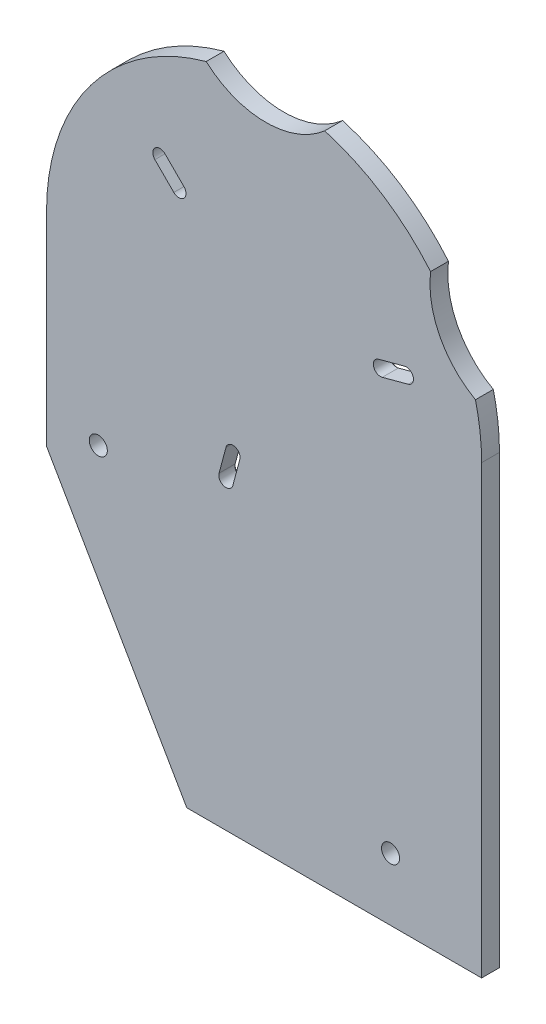
ISO-10303-21;
HEADER;
FILE_DESCRIPTION(('STEP AP214'),'2;1');
FILE_NAME('part.step','',(''),(''),'','','');
FILE_SCHEMA(('AUTOMOTIVE_DESIGN { 1 0 10303 214 1 1 1 1 }'));
ENDSEC;
DATA;
#1=APPLICATION_CONTEXT('core data for automotive mechanical design processes');
#2=APPLICATION_PROTOCOL_DEFINITION('international standard','automotive_design',2000,#1);
#3=PRODUCT_CONTEXT('',#1,'mechanical');
#4=PRODUCT('Part','Part','',(#3));
#5=PRODUCT_RELATED_PRODUCT_CATEGORY('part','',(#4));
#6=PRODUCT_DEFINITION_FORMATION('','',#4);
#7=PRODUCT_DEFINITION_CONTEXT('part definition',#1,'design');
#8=PRODUCT_DEFINITION('design','',#6,#7);
#9=PRODUCT_DEFINITION_SHAPE('','',#8);
#10=(LENGTH_UNIT() NAMED_UNIT(*) SI_UNIT(.MILLI.,.METRE.));
#11=(NAMED_UNIT(*) PLANE_ANGLE_UNIT() SI_UNIT($,.RADIAN.));
#12=(NAMED_UNIT(*) SI_UNIT($,.STERADIAN.) SOLID_ANGLE_UNIT());
#13=UNCERTAINTY_MEASURE_WITH_UNIT(LENGTH_MEASURE(1.E-05),#10,'distance_accuracy_value','');
#14=(GEOMETRIC_REPRESENTATION_CONTEXT(3) GLOBAL_UNCERTAINTY_ASSIGNED_CONTEXT((#13)) GLOBAL_UNIT_ASSIGNED_CONTEXT((#10,
#11,#12)) REPRESENTATION_CONTEXT('',''));
#15=CARTESIAN_POINT('',(0.,0.,0.));
#16=DIRECTION('',(0.,0.,1.));
#17=DIRECTION('',(1.,0.,0.));
#18=AXIS2_PLACEMENT_3D('',#15,#16,#17);
#19=CARTESIAN_POINT('',(0.,0.,0.));
#20=DIRECTION('',(1.,0.,0.));
#21=DIRECTION('',(0.,1.,0.));
#22=AXIS2_PLACEMENT_3D('',#19,#20,#21);
#23=PLANE('',#22);
#24=DIRECTION('',(0.,1.,0.));
#25=VECTOR('',#24,1.);
#26=CARTESIAN_POINT('',(0.,0.,0.));
#27=LINE('',#26,#25);
#28=CARTESIAN_POINT('',(0.,0.,0.));
#29=VERTEX_POINT('',#28);
#30=CARTESIAN_POINT('',(-5.49782441794378E-12,250.,0.));
#31=VERTEX_POINT('',#30);
#32=EDGE_CURVE('E362',#29,#31,#27,.T.);
#33=ORIENTED_EDGE('',*,*,#32,.T.);
#34=DIRECTION('',(0.,0.,1.));
#35=VECTOR('',#34,1.);
#36=CARTESIAN_POINT('',(-5.49782441794378E-12,250.,0.));
#37=LINE('',#36,#35);
#38=CARTESIAN_POINT('',(-5.49782441794378E-12,250.,10.));
#39=VERTEX_POINT('',#38);
#40=EDGE_CURVE('E186',#31,#39,#37,.T.);
#41=ORIENTED_EDGE('',*,*,#40,.T.);
#42=DIRECTION('',(0.,1.,0.));
#43=VECTOR('',#42,1.);
#44=CARTESIAN_POINT('',(0.,0.,10.));
#45=LINE('',#44,#43);
#46=CARTESIAN_POINT('',(0.,0.,10.));
#47=VERTEX_POINT('',#46);
#48=EDGE_CURVE('E403',#47,#39,#45,.T.);
#49=ORIENTED_EDGE('',*,*,#48,.F.);
#50=DIRECTION('',(0.,0.,1.));
#51=VECTOR('',#50,1.);
#52=CARTESIAN_POINT('',(0.,0.,0.));
#53=LINE('',#52,#51);
#54=EDGE_CURVE('E198',#29,#47,#53,.T.);
#55=ORIENTED_EDGE('',*,*,#54,.F.);
#56=EDGE_LOOP('',(#33,#41,#49,#55));
#57=FACE_BOUND('',#56,.T.);
#58=ADVANCED_FACE('F17',(#57),#23,.T.);
#59=CARTESIAN_POINT('',(-243.730669589464,249.999999999997,0.));
#60=DIRECTION('',(-1.,0.,0.));
#61=DIRECTION('',(0.,0.,1.));
#62=AXIS2_PLACEMENT_3D('',#59,#60,#61);
#63=PLANE('',#62);
#64=DIRECTION('',(0.,-1.,0.));
#65=VECTOR('',#64,1.);
#66=CARTESIAN_POINT('',(-243.730669589464,249.999999999997,0.));
#67=LINE('',#66,#65);
#68=CARTESIAN_POINT('',(-243.730669589464,249.999999999997,0.));
#69=VERTEX_POINT('',#68);
#70=CARTESIAN_POINT('',(-243.730669589466,136.076951569371,0.));
#71=VERTEX_POINT('',#70);
#72=EDGE_CURVE('E413',#69,#71,#67,.T.);
#73=ORIENTED_EDGE('',*,*,#72,.T.);
#74=DIRECTION('',(0.,0.,1.));
#75=VECTOR('',#74,1.);
#76=CARTESIAN_POINT('',(-243.730669589466,136.076951569371,0.));
#77=LINE('',#76,#75);
#78=CARTESIAN_POINT('',(-243.730669589466,136.076951569371,10.));
#79=VERTEX_POINT('',#78);
#80=EDGE_CURVE('E11',#71,#79,#77,.T.);
#81=ORIENTED_EDGE('',*,*,#80,.T.);
#82=DIRECTION('',(0.,-1.,0.));
#83=VECTOR('',#82,1.);
#84=CARTESIAN_POINT('',(-243.730669589464,249.999999999997,10.));
#85=LINE('',#84,#83);
#86=CARTESIAN_POINT('',(-243.730669589464,249.999999999997,10.));
#87=VERTEX_POINT('',#86);
#88=EDGE_CURVE('E384',#87,#79,#85,.T.);
#89=ORIENTED_EDGE('',*,*,#88,.F.);
#90=DIRECTION('',(0.,0.,1.));
#91=VECTOR('',#90,1.);
#92=CARTESIAN_POINT('',(-243.730669589464,249.999999999997,0.));
#93=LINE('',#92,#91);
#94=EDGE_CURVE('E470',#69,#87,#93,.T.);
#95=ORIENTED_EDGE('',*,*,#94,.F.);
#96=EDGE_LOOP('',(#73,#81,#89,#95));
#97=FACE_BOUND('',#96,.T.);
#98=ADVANCED_FACE('F660',(#97),#63,.T.);
#99=CARTESIAN_POINT('',(-243.730669589466,136.076951569371,0.));
#100=DIRECTION('',(-0.866025403784437,-0.5,0.));
#101=DIRECTION('',(-0.5,0.866025403784437,0.));
#102=AXIS2_PLACEMENT_3D('',#99,#100,#101);
#103=PLANE('',#102);
#104=DIRECTION('',(0.5,-0.866025403784437,0.));
#105=VECTOR('',#104,1.);
#106=CARTESIAN_POINT('',(-243.730669589466,136.076951569371,0.));
#107=LINE('',#106,#105);
#108=CARTESIAN_POINT('',(-165.166604970383,-3.69482222595252E-12,0.));
#109=VERTEX_POINT('',#108);
#110=EDGE_CURVE('E410',#71,#109,#107,.T.);
#111=ORIENTED_EDGE('',*,*,#110,.T.);
#112=DIRECTION('',(0.,0.,1.));
#113=VECTOR('',#112,1.);
#114=CARTESIAN_POINT('',(-165.166604970383,-3.69482222595252E-12,0.));
#115=LINE('',#114,#113);
#116=CARTESIAN_POINT('',(-165.166604970383,-3.69482222595252E-12,10.));
#117=VERTEX_POINT('',#116);
#118=EDGE_CURVE('E28',#109,#117,#115,.T.);
#119=ORIENTED_EDGE('',*,*,#118,.T.);
#120=DIRECTION('',(0.5,-0.866025403784437,0.));
#121=VECTOR('',#120,1.);
#122=CARTESIAN_POINT('',(-243.730669589466,136.076951569371,10.));
#123=LINE('',#122,#121);
#124=EDGE_CURVE('E379',#79,#117,#123,.T.);
#125=ORIENTED_EDGE('',*,*,#124,.F.);
#126=ORIENTED_EDGE('',*,*,#80,.F.);
#127=EDGE_LOOP('',(#111,#119,#125,#126));
#128=FACE_BOUND('',#127,.T.);
#129=ADVANCED_FACE('F665',(#128),#103,.T.);
#130=CARTESIAN_POINT('',(-165.166604970383,-3.69482222595252E-12,0.));
#131=DIRECTION('',(0.,-1.,0.));
#132=DIRECTION('',(0.,0.,-1.));
#133=AXIS2_PLACEMENT_3D('',#130,#131,#132);
#134=PLANE('',#133);
#135=DIRECTION('',(1.,0.,0.));
#136=VECTOR('',#135,1.);
#137=CARTESIAN_POINT('',(-165.166604970383,-3.69482222595252E-12,0.));
#138=LINE('',#137,#136);
#139=EDGE_CURVE('E365',#109,#29,#138,.T.);
#140=ORIENTED_EDGE('',*,*,#139,.T.);
#141=ORIENTED_EDGE('',*,*,#54,.T.);
#142=DIRECTION('',(1.,0.,0.));
#143=VECTOR('',#142,1.);
#144=CARTESIAN_POINT('',(-165.166604970383,-3.69482222595252E-12,10.));
#145=LINE('',#144,#143);
#146=EDGE_CURVE('E383',#117,#47,#145,.T.);
#147=ORIENTED_EDGE('',*,*,#146,.F.);
#148=ORIENTED_EDGE('',*,*,#118,.F.);
#149=EDGE_LOOP('',(#140,#141,#147,#148));
#150=FACE_BOUND('',#149,.T.);
#151=ADVANCED_FACE('F674',(#150),#134,.T.);
#152=CARTESIAN_POINT('',(-51.0000000000008,34.9999999999989,0.));
#153=DIRECTION('',(0.,0.,1.));
#154=DIRECTION('',(-1.,0.,0.));
#155=AXIS2_PLACEMENT_3D('',#152,#153,#154);
#156=CYLINDRICAL_SURFACE('',#155,5.05);
#157=CARTESIAN_POINT('',(-51.0000000000008,34.9999999999989,0.));
#158=DIRECTION('',(0.,0.,1.));
#159=DIRECTION('',(-1.,0.,0.));
#160=AXIS2_PLACEMENT_3D('',#157,#158,#159);
#161=CIRCLE('',#160,5.05);
#162=CARTESIAN_POINT('',(-45.9500000000008,34.9999999999989,0.));
#163=VERTEX_POINT('',#162);
#164=EDGE_CURVE('E302',#163,#163,#161,.T.);
#165=ORIENTED_EDGE('',*,*,#164,.F.);
#166=DIRECTION('',(0.,0.,1.));
#167=VECTOR('',#166,1.);
#168=CARTESIAN_POINT('',(-45.9500000000008,34.9999999999989,0.));
#169=LINE('',#168,#167);
#170=CARTESIAN_POINT('',(-45.9500000000008,34.9999999999989,10.));
#171=VERTEX_POINT('',#170);
#172=EDGE_CURVE('E445',#163,#171,#169,.T.);
#173=ORIENTED_EDGE('',*,*,#172,.T.);
#174=CARTESIAN_POINT('',(-51.0000000000008,34.9999999999989,10.));
#175=DIRECTION('',(0.,0.,-1.));
#176=DIRECTION('',(-1.,0.,0.));
#177=AXIS2_PLACEMENT_3D('',#174,#175,#176);
#178=CIRCLE('',#177,5.05);
#179=EDGE_CURVE('E309',#171,#171,#178,.T.);
#180=ORIENTED_EDGE('',*,*,#179,.F.);
#181=ORIENTED_EDGE('',*,*,#172,.F.);
#182=EDGE_LOOP('',(#165,#173,#180,#181));
#183=FACE_BOUND('',#182,.T.);
#184=ADVANCED_FACE('F670',(#183),#156,.F.);
#185=CARTESIAN_POINT('',(-214.730669589466,150.999999999995,0.));
#186=DIRECTION('',(0.,0.,1.));
#187=DIRECTION('',(-1.,0.,0.));
#188=AXIS2_PLACEMENT_3D('',#185,#186,#187);
#189=CYLINDRICAL_SURFACE('',#188,5.05);
#190=CARTESIAN_POINT('',(-214.730669589466,150.999999999995,0.));
#191=DIRECTION('',(0.,0.,1.));
#192=DIRECTION('',(-1.,0.,0.));
#193=AXIS2_PLACEMENT_3D('',#190,#191,#192);
#194=CIRCLE('',#193,5.05);
#195=CARTESIAN_POINT('',(-209.680669589466,150.999999999995,0.));
#196=VERTEX_POINT('',#195);
#197=EDGE_CURVE('E492',#196,#196,#194,.T.);
#198=ORIENTED_EDGE('',*,*,#197,.F.);
#199=DIRECTION('',(0.,0.,1.));
#200=VECTOR('',#199,1.);
#201=CARTESIAN_POINT('',(-209.680669589466,150.999999999995,0.));
#202=LINE('',#201,#200);
#203=CARTESIAN_POINT('',(-209.680669589466,150.999999999995,10.));
#204=VERTEX_POINT('',#203);
#205=EDGE_CURVE('E448',#196,#204,#202,.T.);
#206=ORIENTED_EDGE('',*,*,#205,.T.);
#207=CARTESIAN_POINT('',(-214.730669589466,150.999999999995,10.));
#208=DIRECTION('',(0.,0.,-1.));
#209=DIRECTION('',(-1.,0.,0.));
#210=AXIS2_PLACEMENT_3D('',#207,#208,#209);
#211=CIRCLE('',#210,5.05);
#212=EDGE_CURVE('E313',#204,#204,#211,.T.);
#213=ORIENTED_EDGE('',*,*,#212,.F.);
#214=ORIENTED_EDGE('',*,*,#205,.F.);
#215=EDGE_LOOP('',(#198,#206,#213,#214));
#216=FACE_BOUND('',#215,.T.);
#217=ADVANCED_FACE('F673',(#216),#189,.F.);
#218=CARTESIAN_POINT('',(-139.354202710538,169.275843150739,0.));
#219=DIRECTION('',(0.965925826289063,-0.258819045102539,0.));
#220=DIRECTION('',(0.,0.,-1.));
#221=AXIS2_PLACEMENT_3D('',#218,#219,#220);
#222=PLANE('',#221);
#223=DIRECTION('',(0.258819045102539,0.965925826289063,0.));
#224=VECTOR('',#223,1.);
#225=CARTESIAN_POINT('',(-139.290718372318,169.512769926463,1.));
#226=LINE('',#225,#224);
#227=CARTESIAN_POINT('',(-139.354202710538,169.275843150739,1.));
#228=VERTEX_POINT('',#227);
#229=CARTESIAN_POINT('',(-135.471917034,183.764730545075,1.));
#230=VERTEX_POINT('',#229);
#231=EDGE_CURVE('E375',#228,#230,#226,.T.);
#232=ORIENTED_EDGE('',*,*,#231,.F.);
#233=DIRECTION('',(0.,0.,1.));
#234=VECTOR('',#233,1.);
#235=CARTESIAN_POINT('',(-139.354202710538,169.275843150739,0.));
#236=LINE('',#235,#234);
#237=CARTESIAN_POINT('',(-139.354202710538,169.275843150739,10.));
#238=VERTEX_POINT('',#237);
#239=EDGE_CURVE('E422',#228,#238,#236,.T.);
#240=ORIENTED_EDGE('',*,*,#239,.T.);
#241=DIRECTION('',(-0.258819045102539,-0.965925826289063,0.));
#242=VECTOR('',#241,1.);
#243=CARTESIAN_POINT('',(-139.290718372318,169.512769926463,10.));
#244=LINE('',#243,#242);
#245=CARTESIAN_POINT('',(-135.471917034,183.764730545075,10.));
#246=VERTEX_POINT('',#245);
#247=EDGE_CURVE('E336',#246,#238,#244,.T.);
#248=ORIENTED_EDGE('',*,*,#247,.F.);
#249=DIRECTION('',(0.,0.,1.));
#250=VECTOR('',#249,1.);
#251=CARTESIAN_POINT('',(-135.471917034,183.764730545075,0.));
#252=LINE('',#251,#250);
#253=EDGE_CURVE('E42',#230,#246,#252,.T.);
#254=ORIENTED_EDGE('',*,*,#253,.F.);
#255=EDGE_LOOP('',(#232,#240,#248,#254));
#256=FACE_BOUND('',#255,.T.);
#257=ADVANCED_FACE('F721',(#256),#222,.F.);
#258=CARTESIAN_POINT('',(-139.335620339156,184.800006725486,0.));
#259=DIRECTION('',(0.,0.,1.));
#260=DIRECTION('',(0.965925826289062,-0.258819045102544,0.));
#261=AXIS2_PLACEMENT_3D('',#258,#259,#260);
#262=CYLINDRICAL_SURFACE('',#261,4.);
#263=CARTESIAN_POINT('',(-139.335620339156,184.800006725486,1.));
#264=DIRECTION('',(0.,0.,1.));
#265=DIRECTION('',(0.965925826289062,-0.258819045102544,0.));
#266=AXIS2_PLACEMENT_3D('',#263,#264,#265);
#267=CIRCLE('',#266,4.);
#268=CARTESIAN_POINT('',(-143.199323644312,185.835282905896,1.));
#269=VERTEX_POINT('',#268);
#270=EDGE_CURVE('E370',#230,#269,#267,.T.);
#271=ORIENTED_EDGE('',*,*,#270,.F.);
#272=ORIENTED_EDGE('',*,*,#253,.T.);
#273=CARTESIAN_POINT('',(-139.335620339156,184.800006725486,10.));
#274=DIRECTION('',(0.,0.,-1.));
#275=DIRECTION('',(0.965925826289062,-0.258819045102544,0.));
#276=AXIS2_PLACEMENT_3D('',#273,#274,#275);
#277=CIRCLE('',#276,4.);
#278=CARTESIAN_POINT('',(-143.199323644312,185.835282905896,10.));
#279=VERTEX_POINT('',#278);
#280=EDGE_CURVE('E361',#279,#246,#277,.T.);
#281=ORIENTED_EDGE('',*,*,#280,.F.);
#282=DIRECTION('',(0.,0.,1.));
#283=VECTOR('',#282,1.);
#284=CARTESIAN_POINT('',(-143.199323644312,185.835282905896,0.));
#285=LINE('',#284,#283);
#286=EDGE_CURVE('E433',#269,#279,#285,.T.);
#287=ORIENTED_EDGE('',*,*,#286,.F.);
#288=EDGE_LOOP('',(#271,#272,#281,#287));
#289=FACE_BOUND('',#288,.T.);
#290=ADVANCED_FACE('F715',(#289),#262,.F.);
#291=CARTESIAN_POINT('',(-55.6300653398122,263.60658223926,0.));
#292=DIRECTION('',(0.258819045102501,-0.965925826289074,0.));
#293=DIRECTION('',(0.,0.,-1.));
#294=AXIS2_PLACEMENT_3D('',#291,#292,#293);
#295=PLANE('',#294);
#296=DIRECTION('',(0.965925826289074,0.258819045102501,0.));
#297=VECTOR('',#296,1.);
#298=CARTESIAN_POINT('',(-94.3519523612637,253.231083882454,1.));
#299=LINE('',#298,#297);
#300=CARTESIAN_POINT('',(-55.6300653398122,263.60658223926,1.));
#301=VERTEX_POINT('',#300);
#302=CARTESIAN_POINT('',(-41.1411779454761,267.488867915797,1.));
#303=VERTEX_POINT('',#302);
#304=EDGE_CURVE('E323',#301,#303,#299,.T.);
#305=ORIENTED_EDGE('',*,*,#304,.F.);
#306=DIRECTION('',(0.,0.,1.));
#307=VECTOR('',#306,1.);
#308=CARTESIAN_POINT('',(-55.6300653398122,263.60658223926,0.));
#309=LINE('',#308,#307);
#310=CARTESIAN_POINT('',(-55.6300653398122,263.60658223926,10.));
#311=VERTEX_POINT('',#310);
#312=EDGE_CURVE('E347',#301,#311,#309,.T.);
#313=ORIENTED_EDGE('',*,*,#312,.T.);
#314=DIRECTION('',(-0.965925826289074,-0.258819045102501,0.));
#315=VECTOR('',#314,1.);
#316=CARTESIAN_POINT('',(-94.3519523612637,253.231083882454,10.));
#317=LINE('',#316,#315);
#318=CARTESIAN_POINT('',(-41.1411779454761,267.488867915797,10.));
#319=VERTEX_POINT('',#318);
#320=EDGE_CURVE('E292',#319,#311,#317,.T.);
#321=ORIENTED_EDGE('',*,*,#320,.F.);
#322=DIRECTION('',(0.,0.,1.));
#323=VECTOR('',#322,1.);
#324=CARTESIAN_POINT('',(-41.1411779454761,267.488867915797,0.));
#325=LINE('',#324,#323);
#326=EDGE_CURVE('E437',#303,#319,#325,.T.);
#327=ORIENTED_EDGE('',*,*,#326,.F.);
#328=EDGE_LOOP('',(#305,#313,#321,#327));
#329=FACE_BOUND('',#328,.T.);
#330=ADVANCED_FACE('F709',(#329),#295,.F.);
#331=CARTESIAN_POINT('',(-42.1764541258861,271.352571220954,0.));
#332=DIRECTION('',(0.,0.,1.));
#333=DIRECTION('',(0.258819045102498,-0.965925826289074,0.));
#334=AXIS2_PLACEMENT_3D('',#331,#332,#333);
#335=CYLINDRICAL_SURFACE('',#334,4.);
#336=CARTESIAN_POINT('',(-42.1764541258861,271.352571220954,1.));
#337=DIRECTION('',(0.,0.,1.));
#338=DIRECTION('',(0.258819045102498,-0.965925826289074,0.));
#339=AXIS2_PLACEMENT_3D('',#336,#337,#338);
#340=CIRCLE('',#339,4.);
#341=CARTESIAN_POINT('',(-43.2117303062961,275.21627452611,1.));
#342=VERTEX_POINT('',#341);
#343=EDGE_CURVE('E409',#303,#342,#340,.T.);
#344=ORIENTED_EDGE('',*,*,#343,.F.);
#345=ORIENTED_EDGE('',*,*,#326,.T.);
#346=CARTESIAN_POINT('',(-42.1764541258861,271.352571220954,10.));
#347=DIRECTION('',(0.,0.,-1.));
#348=DIRECTION('',(0.258819045102498,-0.965925826289074,0.));
#349=AXIS2_PLACEMENT_3D('',#346,#347,#348);
#350=CIRCLE('',#349,4.);
#351=CARTESIAN_POINT('',(-43.2117303062961,275.21627452611,10.));
#352=VERTEX_POINT('',#351);
#353=EDGE_CURVE('E295',#352,#319,#350,.T.);
#354=ORIENTED_EDGE('',*,*,#353,.F.);
#355=DIRECTION('',(0.,0.,1.));
#356=VECTOR('',#355,1.);
#357=CARTESIAN_POINT('',(-43.2117303062961,275.21627452611,0.));
#358=LINE('',#357,#356);
#359=EDGE_CURVE('E342',#342,#352,#358,.T.);
#360=ORIENTED_EDGE('',*,*,#359,.F.);
#361=EDGE_LOOP('',(#344,#345,#354,#360));
#362=FACE_BOUND('',#361,.T.);
#363=ADVANCED_FACE('F705',(#362),#335,.F.);
#364=CARTESIAN_POINT('',(-183.03007136737,305.507882323142,0.));
#365=DIRECTION('',(-0.707106781186562,-0.707106781186534,0.));
#366=DIRECTION('',(-0.707106781186534,0.707106781186562,0.));
#367=AXIS2_PLACEMENT_3D('',#364,#365,#366);
#368=PLANE('',#367);
#369=DIRECTION('',(0.707106781186534,-0.707106781186562,0.));
#370=VECTOR('',#369,1.);
#371=CARTESIAN_POINT('',(-129.348739156582,251.826550112352,1.));
#372=LINE('',#371,#370);
#373=CARTESIAN_POINT('',(-183.03007136737,305.507882323142,1.));
#374=VERTEX_POINT('',#373);
#375=CARTESIAN_POINT('',(-172.423469649572,294.901280605344,1.));
#376=VERTEX_POINT('',#375);
#377=EDGE_CURVE('E264',#374,#376,#372,.T.);
#378=ORIENTED_EDGE('',*,*,#377,.F.);
#379=DIRECTION('',(0.,0.,1.));
#380=VECTOR('',#379,1.);
#381=CARTESIAN_POINT('',(-183.03007136737,305.507882323142,0.));
#382=LINE('',#381,#380);
#383=CARTESIAN_POINT('',(-183.03007136737,305.507882323142,10.));
#384=VERTEX_POINT('',#383);
#385=EDGE_CURVE('E256',#374,#384,#382,.T.);
#386=ORIENTED_EDGE('',*,*,#385,.T.);
#387=DIRECTION('',(-0.707106781186534,0.707106781186562,0.));
#388=VECTOR('',#387,1.);
#389=CARTESIAN_POINT('',(-129.348739156582,251.826550112352,10.));
#390=LINE('',#389,#388);
#391=CARTESIAN_POINT('',(-172.423469649572,294.901280605344,10.));
#392=VERTEX_POINT('',#391);
#393=EDGE_CURVE('E261',#392,#384,#390,.T.);
#394=ORIENTED_EDGE('',*,*,#393,.F.);
#395=DIRECTION('',(0.,0.,1.));
#396=VECTOR('',#395,1.);
#397=CARTESIAN_POINT('',(-172.423469649572,294.901280605344,0.));
#398=LINE('',#397,#396);
#399=EDGE_CURVE('E434',#376,#392,#398,.T.);
#400=ORIENTED_EDGE('',*,*,#399,.F.);
#401=EDGE_LOOP('',(#378,#386,#394,#400));
#402=FACE_BOUND('',#401,.T.);
#403=ADVANCED_FACE('F258',(#402),#368,.F.);
#404=CARTESIAN_POINT('',(-169.595042524826,297.72970773009,0.));
#405=DIRECTION('',(0.,0.,1.));
#406=DIRECTION('',(-0.707106781186565,-0.70710678118653,0.));
#407=AXIS2_PLACEMENT_3D('',#404,#405,#406);
#408=CYLINDRICAL_SURFACE('',#407,4.);
#409=CARTESIAN_POINT('',(-169.595042524826,297.72970773009,1.));
#410=DIRECTION('',(0.,0.,1.));
#411=DIRECTION('',(-0.707106781186565,-0.70710678118653,0.));
#412=AXIS2_PLACEMENT_3D('',#409,#410,#411);
#413=CIRCLE('',#412,4.);
#414=CARTESIAN_POINT('',(-166.766615400079,300.558134854836,1.));
#415=VERTEX_POINT('',#414);
#416=EDGE_CURVE('E397',#376,#415,#413,.T.);
#417=ORIENTED_EDGE('',*,*,#416,.F.);
#418=ORIENTED_EDGE('',*,*,#399,.T.);
#419=CARTESIAN_POINT('',(-169.595042524826,297.72970773009,10.));
#420=DIRECTION('',(0.,0.,-1.));
#421=DIRECTION('',(-0.707106781186565,-0.70710678118653,0.));
#422=AXIS2_PLACEMENT_3D('',#419,#420,#421);
#423=CIRCLE('',#422,4.);
#424=CARTESIAN_POINT('',(-166.766615400079,300.558134854836,10.));
#425=VERTEX_POINT('',#424);
#426=EDGE_CURVE('E285',#425,#392,#423,.T.);
#427=ORIENTED_EDGE('',*,*,#426,.F.);
#428=DIRECTION('',(0.,0.,1.));
#429=VECTOR('',#428,1.);
#430=CARTESIAN_POINT('',(-166.766615400079,300.558134854836,0.));
#431=LINE('',#430,#429);
#432=EDGE_CURVE('E269',#415,#425,#431,.T.);
#433=ORIENTED_EDGE('',*,*,#432,.F.);
#434=EDGE_LOOP('',(#417,#418,#427,#433));
#435=FACE_BOUND('',#434,.T.);
#436=ADVANCED_FACE('F595',(#435),#408,.F.);
#437=CARTESIAN_POINT('',(-143.199323644312,185.835282905896,0.));
#438=DIRECTION('',(-0.965925826289063,0.25881904510254,0.));
#439=DIRECTION('',(0.,0.,1.));
#440=AXIS2_PLACEMENT_3D('',#437,#438,#439);
#441=PLANE('',#440);
#442=DIRECTION('',(-0.25881904510254,-0.965925826289063,0.));
#443=VECTOR('',#442,1.);
#444=CARTESIAN_POINT('',(-145.076982144361,178.827765984451,1.));
#445=LINE('',#444,#443);
#446=CARTESIAN_POINT('',(-147.08160932085,171.34639551156,1.));
#447=VERTEX_POINT('',#446);
#448=EDGE_CURVE('E414',#269,#447,#445,.T.);
#449=ORIENTED_EDGE('',*,*,#448,.F.);
#450=ORIENTED_EDGE('',*,*,#286,.T.);
#451=DIRECTION('',(0.25881904510254,0.965925826289063,0.));
#452=VECTOR('',#451,1.);
#453=CARTESIAN_POINT('',(-145.076982144361,178.827765984451,10.));
#454=LINE('',#453,#452);
#455=CARTESIAN_POINT('',(-147.08160932085,171.34639551156,10.));
#456=VERTEX_POINT('',#455);
#457=EDGE_CURVE('E335',#456,#279,#454,.T.);
#458=ORIENTED_EDGE('',*,*,#457,.F.);
#459=DIRECTION('',(0.,0.,1.));
#460=VECTOR('',#459,1.);
#461=CARTESIAN_POINT('',(-147.08160932085,171.34639551156,0.));
#462=LINE('',#461,#460);
#463=EDGE_CURVE('E374',#447,#456,#462,.T.);
#464=ORIENTED_EDGE('',*,*,#463,.F.);
#465=EDGE_LOOP('',(#449,#450,#458,#464));
#466=FACE_BOUND('',#465,.T.);
#467=ADVANCED_FACE('F695',(#466),#441,.F.);
#468=CARTESIAN_POINT('',(-143.217906015694,170.31111933115,0.));
#469=DIRECTION('',(0.,0.,1.));
#470=DIRECTION('',(-0.965925826289062,0.258819045102543,0.));
#471=AXIS2_PLACEMENT_3D('',#468,#469,#470);
#472=CYLINDRICAL_SURFACE('',#471,4.);
#473=CARTESIAN_POINT('',(-143.217906015694,170.31111933115,1.));
#474=DIRECTION('',(0.,0.,1.));
#475=DIRECTION('',(-0.965925826289062,0.258819045102543,0.));
#476=AXIS2_PLACEMENT_3D('',#473,#474,#475);
#477=CIRCLE('',#476,4.);
#478=EDGE_CURVE('E455',#447,#228,#477,.T.);
#479=ORIENTED_EDGE('',*,*,#478,.F.);
#480=ORIENTED_EDGE('',*,*,#463,.T.);
#481=CARTESIAN_POINT('',(-143.217906015694,170.31111933115,10.));
#482=DIRECTION('',(0.,0.,-1.));
#483=DIRECTION('',(-0.965925826289062,0.258819045102543,0.));
#484=AXIS2_PLACEMENT_3D('',#481,#482,#483);
#485=CIRCLE('',#484,4.);
#486=EDGE_CURVE('E331',#238,#456,#485,.T.);
#487=ORIENTED_EDGE('',*,*,#486,.F.);
#488=ORIENTED_EDGE('',*,*,#239,.F.);
#489=EDGE_LOOP('',(#479,#480,#487,#488));
#490=FACE_BOUND('',#489,.T.);
#491=ADVANCED_FACE('F692',(#490),#472,.F.);
#492=CARTESIAN_POINT('',(-139.335620339156,184.800006725486,0.5));
#493=DIRECTION('',(0.,0.,-1.));
#494=DIRECTION('',(0.965925826289062,-0.258819045102544,0.));
#495=AXIS2_PLACEMENT_3D('',#492,#493,#494);
#496=CONICAL_SURFACE('',#495,4.5,0.785398163397457);
#497=DIRECTION('',(0.683012701892216,-0.183012701892229,0.707106781186548));
#498=VECTOR('',#497,1.);
#499=CARTESIAN_POINT('',(-144.165249470601,186.094101950998,0.));
#500=LINE('',#499,#498);
#501=CARTESIAN_POINT('',(-144.165249470601,186.094101950998,0.));
#502=VERTEX_POINT('',#501);
#503=EDGE_CURVE('E419',#502,#269,#500,.T.);
#504=ORIENTED_EDGE('',*,*,#503,.F.);
#505=CARTESIAN_POINT('',(-139.335620339156,184.800006725486,0.));
#506=DIRECTION('',(0.,0.,-1.));
#507=DIRECTION('',(0.965925826289062,-0.258819045102544,0.));
#508=AXIS2_PLACEMENT_3D('',#505,#506,#507);
#509=CIRCLE('',#508,5.);
#510=CARTESIAN_POINT('',(-134.505991207711,183.505911499973,0.));
#511=VERTEX_POINT('',#510);
#512=EDGE_CURVE('E531',#502,#511,#509,.T.);
#513=ORIENTED_EDGE('',*,*,#512,.T.);
#514=DIRECTION('',(0.683012701892203,-0.183012701892232,-0.70710678118656));
#515=VECTOR('',#514,1.);
#516=CARTESIAN_POINT('',(-135.471917034,183.764730545075,1.));
#517=LINE('',#516,#515);
#518=EDGE_CURVE('E452',#230,#511,#517,.T.);
#519=ORIENTED_EDGE('',*,*,#518,.F.);
#520=ORIENTED_EDGE('',*,*,#270,.T.);
#521=EDGE_LOOP('',(#504,#513,#519,#520));
#522=FACE_BOUND('',#521,.T.);
#523=ADVANCED_FACE('F689',(#522),#496,.F.);
#524=CARTESIAN_POINT('',(-138.807755459173,169.383360403911,0.5));
#525=DIRECTION('',(-0.683012701892228,0.183012701892236,-0.707106781186535));
#526=DIRECTION('',(-0.719254596676393,0.,0.694746590606877));
#527=AXIS2_PLACEMENT_3D('',#524,#525,#526);
#528=PLANE('',#527);
#529=ORIENTED_EDGE('',*,*,#518,.T.);
#530=DIRECTION('',(-0.258819045102539,-0.965925826289063,0.));
#531=VECTOR('',#530,1.);
#532=CARTESIAN_POINT('',(-138.324792546028,169.25395088136,0.));
#533=LINE('',#532,#531);
#534=CARTESIAN_POINT('',(-138.388276884249,169.017024105637,0.));
#535=VERTEX_POINT('',#534);
#536=EDGE_CURVE('E529',#511,#535,#533,.T.);
#537=ORIENTED_EDGE('',*,*,#536,.T.);
#538=DIRECTION('',(0.683012701892223,-0.183012701892227,-0.707106781186542));
#539=VECTOR('',#538,1.);
#540=CARTESIAN_POINT('',(-139.354202710538,169.275843150739,1.));
#541=LINE('',#540,#539);
#542=EDGE_CURVE('E418',#228,#535,#541,.T.);
#543=ORIENTED_EDGE('',*,*,#542,.F.);
#544=ORIENTED_EDGE('',*,*,#231,.T.);
#545=EDGE_LOOP('',(#529,#537,#543,#544));
#546=FACE_BOUND('',#545,.T.);
#547=ADVANCED_FACE('F682',(#546),#528,.T.);
#548=CARTESIAN_POINT('',(-143.217906015694,170.31111933115,0.5));
#549=DIRECTION('',(0.,0.,-1.));
#550=DIRECTION('',(-0.965925826289062,0.258819045102543,0.));
#551=AXIS2_PLACEMENT_3D('',#548,#549,#550);
#552=CONICAL_SURFACE('',#551,4.5,0.785398163397455);
#553=ORIENTED_EDGE('',*,*,#542,.T.);
#554=CARTESIAN_POINT('',(-143.217906015694,170.31111933115,0.));
#555=DIRECTION('',(0.,0.,-1.));
#556=DIRECTION('',(-0.965925826289062,0.258819045102543,0.));
#557=AXIS2_PLACEMENT_3D('',#554,#555,#556);
#558=CIRCLE('',#557,5.);
#559=CARTESIAN_POINT('',(-148.047535147139,171.605214556662,0.));
#560=VERTEX_POINT('',#559);
#561=EDGE_CURVE('E491',#535,#560,#558,.T.);
#562=ORIENTED_EDGE('',*,*,#561,.T.);
#563=DIRECTION('',(-0.683012701892216,0.183012701892229,-0.707106781186548));
#564=VECTOR('',#563,1.);
#565=CARTESIAN_POINT('',(-147.08160932085,171.34639551156,1.));
#566=LINE('',#565,#564);
#567=EDGE_CURVE('E346',#447,#560,#566,.T.);
#568=ORIENTED_EDGE('',*,*,#567,.F.);
#569=ORIENTED_EDGE('',*,*,#478,.T.);
#570=EDGE_LOOP('',(#553,#562,#568,#569));
#571=FACE_BOUND('',#570,.T.);
#572=ADVANCED_FACE('F678',(#571),#552,.F.);
#573=CARTESIAN_POINT('',(-145.559945057505,178.957175507002,0.5));
#574=DIRECTION('',(0.683012701892216,-0.183012701892233,-0.707106781186547));
#575=DIRECTION('',(0.,-0.96810034588637,0.25056280708575));
#576=AXIS2_PLACEMENT_3D('',#573,#574,#575);
#577=PLANE('',#576);
#578=ORIENTED_EDGE('',*,*,#567,.T.);
#579=DIRECTION('',(0.25881904510254,0.965925826289063,0.));
#580=VECTOR('',#579,1.);
#581=CARTESIAN_POINT('',(-146.04290797065,179.086585029553,0.));
#582=LINE('',#581,#580);
#583=EDGE_CURVE('E487',#560,#502,#582,.T.);
#584=ORIENTED_EDGE('',*,*,#583,.T.);
#585=ORIENTED_EDGE('',*,*,#503,.T.);
#586=ORIENTED_EDGE('',*,*,#448,.T.);
#587=EDGE_LOOP('',(#578,#584,#585,#586));
#588=FACE_BOUND('',#587,.T.);
#589=ADVANCED_FACE('F681',(#588),#577,.T.);
#590=CARTESIAN_POINT('',(-43.2117303062961,275.21627452611,0.));
#591=DIRECTION('',(-0.258819045102502,0.965925826289073,0.));
#592=DIRECTION('',(0.,0.,1.));
#593=AXIS2_PLACEMENT_3D('',#590,#591,#592);
#594=PLANE('',#593);
#595=DIRECTION('',(-0.965925826289073,-0.258819045102502,0.));
#596=VECTOR('',#595,1.);
#597=CARTESIAN_POINT('',(-89.1780610249157,262.899633331035,1.));
#598=LINE('',#597,#596);
#599=CARTESIAN_POINT('',(-57.7006177006322,271.333988849572,1.));
#600=VERTEX_POINT('',#599);
#601=EDGE_CURVE('E319',#342,#600,#598,.T.);
#602=ORIENTED_EDGE('',*,*,#601,.F.);
#603=ORIENTED_EDGE('',*,*,#359,.T.);
#604=DIRECTION('',(0.965925826289073,0.258819045102502,0.));
#605=VECTOR('',#604,1.);
#606=CARTESIAN_POINT('',(-89.1780610249157,262.899633331035,10.));
#607=LINE('',#606,#605);
#608=CARTESIAN_POINT('',(-57.7006177006322,271.333988849572,10.));
#609=VERTEX_POINT('',#608);
#610=EDGE_CURVE('E337',#609,#352,#607,.T.);
#611=ORIENTED_EDGE('',*,*,#610,.F.);
#612=DIRECTION('',(0.,0.,1.));
#613=VECTOR('',#612,1.);
#614=CARTESIAN_POINT('',(-57.7006177006322,271.333988849572,0.));
#615=LINE('',#614,#613);
#616=EDGE_CURVE('E406',#600,#609,#615,.T.);
#617=ORIENTED_EDGE('',*,*,#616,.F.);
#618=EDGE_LOOP('',(#602,#603,#611,#617));
#619=FACE_BOUND('',#618,.T.);
#620=ADVANCED_FACE('F778',(#619),#594,.F.);
#621=CARTESIAN_POINT('',(-56.6653415202222,267.470285544416,0.));
#622=DIRECTION('',(0.,0.,1.));
#623=DIRECTION('',(-0.258819045102497,0.965925826289075,0.));
#624=AXIS2_PLACEMENT_3D('',#621,#622,#623);
#625=CYLINDRICAL_SURFACE('',#624,4.);
#626=CARTESIAN_POINT('',(-56.6653415202222,267.470285544416,1.));
#627=DIRECTION('',(0.,0.,1.));
#628=DIRECTION('',(-0.258819045102497,0.965925826289075,0.));
#629=AXIS2_PLACEMENT_3D('',#626,#627,#628);
#630=CIRCLE('',#629,4.);
#631=EDGE_CURVE('E324',#600,#301,#630,.T.);
#632=ORIENTED_EDGE('',*,*,#631,.F.);
#633=ORIENTED_EDGE('',*,*,#616,.T.);
#634=CARTESIAN_POINT('',(-56.6653415202222,267.470285544416,10.));
#635=DIRECTION('',(0.,0.,-1.));
#636=DIRECTION('',(-0.258819045102497,0.965925826289075,0.));
#637=AXIS2_PLACEMENT_3D('',#634,#635,#636);
#638=CIRCLE('',#637,4.);
#639=EDGE_CURVE('E341',#311,#609,#638,.T.);
#640=ORIENTED_EDGE('',*,*,#639,.F.);
#641=ORIENTED_EDGE('',*,*,#312,.F.);
#642=EDGE_LOOP('',(#632,#633,#640,#641));
#643=FACE_BOUND('',#642,.T.);
#644=ADVANCED_FACE('F793',(#643),#625,.F.);
#645=CARTESIAN_POINT('',(-42.1764541258861,271.352571220954,0.5));
#646=DIRECTION('',(0.,0.,-1.));
#647=DIRECTION('',(0.258819045102498,-0.965925826289074,0.));
#648=AXIS2_PLACEMENT_3D('',#645,#646,#647);
#649=CONICAL_SURFACE('',#648,4.5,0.785398163397447);
#650=DIRECTION('',(0.183012701892209,-0.683012701892251,0.70710678118652));
#651=VECTOR('',#650,1.);
#652=CARTESIAN_POINT('',(-43.4705493513987,276.182200352399,0.));
#653=LINE('',#652,#651);
#654=CARTESIAN_POINT('',(-43.4705493513987,276.182200352399,0.));
#655=VERTEX_POINT('',#654);
#656=EDGE_CURVE('E315',#655,#342,#653,.T.);
#657=ORIENTED_EDGE('',*,*,#656,.F.);
#658=CARTESIAN_POINT('',(-42.1764541258861,271.352571220954,0.));
#659=DIRECTION('',(0.,0.,-1.));
#660=DIRECTION('',(0.258819045102498,-0.965925826289074,0.));
#661=AXIS2_PLACEMENT_3D('',#658,#659,#660);
#662=CIRCLE('',#661,5.);
#663=CARTESIAN_POINT('',(-40.8823589003736,266.522942089508,0.));
#664=VERTEX_POINT('',#663);
#665=EDGE_CURVE('E298',#655,#664,#662,.T.);
#666=ORIENTED_EDGE('',*,*,#665,.T.);
#667=DIRECTION('',(0.183012701892215,-0.68301270189225,-0.707106781186519));
#668=VECTOR('',#667,1.);
#669=CARTESIAN_POINT('',(-41.1411779454761,267.488867915797,1.));
#670=LINE('',#669,#668);
#671=EDGE_CURVE('E320',#303,#664,#670,.T.);
#672=ORIENTED_EDGE('',*,*,#671,.F.);
#673=ORIENTED_EDGE('',*,*,#343,.T.);
#674=EDGE_LOOP('',(#657,#666,#672,#673));
#675=FACE_BOUND('',#674,.T.);
#676=ADVANCED_FACE('F775',(#675),#649,.F.);
#677=CARTESIAN_POINT('',(-94.2225428387125,252.748120969309,0.5));
#678=DIRECTION('',(-0.183012701892201,0.683012701892208,-0.707106781186563));
#679=DIRECTION('',(-0.968100345886382,0.,0.250562807085703));
#680=AXIS2_PLACEMENT_3D('',#677,#678,#679);
#681=PLANE('',#680);
#682=ORIENTED_EDGE('',*,*,#671,.T.);
#683=DIRECTION('',(-0.965925826289074,-0.258819045102501,0.));
#684=VECTOR('',#683,1.);
#685=CARTESIAN_POINT('',(-94.0931333161612,252.265158056165,0.));
#686=LINE('',#685,#684);
#687=CARTESIAN_POINT('',(-55.3712462947097,262.640656412971,0.));
#688=VERTEX_POINT('',#687);
#689=EDGE_CURVE('E303',#664,#688,#686,.T.);
#690=ORIENTED_EDGE('',*,*,#689,.T.);
#691=DIRECTION('',(0.1830127018922,-0.683012701892213,-0.707106781186558));
#692=VECTOR('',#691,1.);
#693=CARTESIAN_POINT('',(-55.6300653398122,263.60658223926,1.));
#694=LINE('',#693,#692);
#695=EDGE_CURVE('E449',#301,#688,#694,.T.);
#696=ORIENTED_EDGE('',*,*,#695,.F.);
#697=ORIENTED_EDGE('',*,*,#304,.T.);
#698=EDGE_LOOP('',(#682,#690,#696,#697));
#699=FACE_BOUND('',#698,.T.);
#700=ADVANCED_FACE('F785',(#699),#681,.T.);
#701=CARTESIAN_POINT('',(-56.6653415202222,267.470285544416,0.5));
#702=DIRECTION('',(0.,0.,-1.));
#703=DIRECTION('',(-0.258819045102497,0.965925826289075,0.));
#704=AXIS2_PLACEMENT_3D('',#701,#702,#703);
#705=CONICAL_SURFACE('',#704,4.5,0.785398163397446);
#706=ORIENTED_EDGE('',*,*,#695,.T.);
#707=CARTESIAN_POINT('',(-56.6653415202222,267.470285544416,0.));
#708=DIRECTION('',(0.,0.,-1.));
#709=DIRECTION('',(-0.258819045102497,0.965925826289075,0.));
#710=AXIS2_PLACEMENT_3D('',#707,#708,#709);
#711=CIRCLE('',#710,5.);
#712=CARTESIAN_POINT('',(-57.9594367457347,272.299914675862,0.));
#713=VERTEX_POINT('',#712);
#714=EDGE_CURVE('E366',#688,#713,#711,.T.);
#715=ORIENTED_EDGE('',*,*,#714,.T.);
#716=DIRECTION('',(-0.183012701892218,0.683012701892263,-0.707106781186506));
#717=VECTOR('',#716,1.);
#718=CARTESIAN_POINT('',(-57.7006177006322,271.333988849572,1.));
#719=LINE('',#718,#717);
#720=EDGE_CURVE('E219',#600,#713,#719,.T.);
#721=ORIENTED_EDGE('',*,*,#720,.F.);
#722=ORIENTED_EDGE('',*,*,#631,.T.);
#723=EDGE_LOOP('',(#706,#715,#721,#722));
#724=FACE_BOUND('',#723,.T.);
#725=ADVANCED_FACE('F19',(#724),#705,.F.);
#726=CARTESIAN_POINT('',(-89.307470547467,263.38259624418,0.5));
#727=DIRECTION('',(0.183012701892199,-0.683012701892196,-0.707106781186575));
#728=DIRECTION('',(0.,-0.719254596676429,0.69474659060684));
#729=AXIS2_PLACEMENT_3D('',#726,#727,#728);
#730=PLANE('',#729);
#731=ORIENTED_EDGE('',*,*,#720,.T.);
#732=DIRECTION('',(0.965925826289073,0.258819045102502,0.));
#733=VECTOR('',#732,1.);
#734=CARTESIAN_POINT('',(-89.4368800700183,263.865559157324,0.));
#735=LINE('',#734,#733);
#736=EDGE_CURVE('E369',#713,#655,#735,.T.);
#737=ORIENTED_EDGE('',*,*,#736,.T.);
#738=ORIENTED_EDGE('',*,*,#656,.T.);
#739=ORIENTED_EDGE('',*,*,#601,.T.);
#740=EDGE_LOOP('',(#731,#737,#738,#739));
#741=FACE_BOUND('',#740,.T.);
#742=ADVANCED_FACE('F698',(#741),#730,.T.);
#743=CARTESIAN_POINT('',(-111.494020354216,162.318604493141,0.));
#744=DIRECTION('',(0.,0.,1.));
#745=DIRECTION('',(1.,0.,0.));
#746=AXIS2_PLACEMENT_3D('',#743,#744,#745);
#747=PLANE('',#746);
#748=DIRECTION('',(0.707106781186533,-0.707106781186562,0.));
#749=VECTOR('',#748,1.);
#750=CARTESIAN_POINT('',(-117.681477267004,252.887210284132,0.));
#751=LINE('',#750,#749);
#752=CARTESIAN_POINT('',(-176.666110336691,311.871843353821,0.));
#753=VERTEX_POINT('',#752);
#754=CARTESIAN_POINT('',(-166.059508618893,301.265241636023,0.));
#755=VERTEX_POINT('',#754);
#756=EDGE_CURVE('E388',#753,#755,#751,.T.);
#757=ORIENTED_EDGE('',*,*,#756,.F.);
#758=CARTESIAN_POINT('',(-180.201644242624,308.336309447888,0.));
#759=DIRECTION('',(0.,0.,-1.));
#760=DIRECTION('',(0.707106781186564,0.707106781186531,0.));
#761=AXIS2_PLACEMENT_3D('',#758,#759,#760);
#762=CIRCLE('',#761,5.);
#763=CARTESIAN_POINT('',(-183.737178148556,304.800775541956,0.));
#764=VERTEX_POINT('',#763);
#765=EDGE_CURVE('E438',#764,#753,#762,.T.);
#766=ORIENTED_EDGE('',*,*,#765,.F.);
#767=DIRECTION('',(-0.707106781186534,0.707106781186562,0.));
#768=VECTOR('',#767,1.);
#769=CARTESIAN_POINT('',(-130.055845937768,251.119443331166,0.));
#770=LINE('',#769,#768);
#771=CARTESIAN_POINT('',(-173.130576430758,294.194173824157,0.));
#772=VERTEX_POINT('',#771);
#773=EDGE_CURVE('E430',#772,#764,#770,.T.);
#774=ORIENTED_EDGE('',*,*,#773,.F.);
#775=CARTESIAN_POINT('',(-169.595042524826,297.72970773009,0.));
#776=DIRECTION('',(0.,0.,-1.));
#777=DIRECTION('',(-0.707106781186565,-0.70710678118653,0.));
#778=AXIS2_PLACEMENT_3D('',#775,#776,#777);
#779=CIRCLE('',#778,5.);
#780=EDGE_CURVE('E393',#755,#772,#779,.T.);
#781=ORIENTED_EDGE('',*,*,#780,.F.);
#782=EDGE_LOOP('',(#757,#766,#774,#781));
#783=FACE_BOUND('',#782,.T.);
#784=ORIENTED_EDGE('',*,*,#583,.F.);
#785=ORIENTED_EDGE('',*,*,#561,.F.);
#786=ORIENTED_EDGE('',*,*,#536,.F.);
#787=ORIENTED_EDGE('',*,*,#512,.F.);
#788=EDGE_LOOP('',(#784,#785,#786,#787));
#789=FACE_BOUND('',#788,.T.);
#790=ORIENTED_EDGE('',*,*,#197,.T.);
#791=EDGE_LOOP('',(#790));
#792=FACE_BOUND('',#791,.T.);
#793=ORIENTED_EDGE('',*,*,#164,.T.);
#794=EDGE_LOOP('',(#793));
#795=FACE_BOUND('',#794,.T.);
#796=ORIENTED_EDGE('',*,*,#736,.F.);
#797=ORIENTED_EDGE('',*,*,#714,.F.);
#798=ORIENTED_EDGE('',*,*,#689,.F.);
#799=ORIENTED_EDGE('',*,*,#665,.F.);
#800=EDGE_LOOP('',(#796,#797,#798,#799));
#801=FACE_BOUND('',#800,.T.);
#802=CARTESIAN_POINT('',(21.048591488536,322.399625412042,0.));
#803=DIRECTION('',(0.,0.,1.));
#804=DIRECTION('',(-0.490089627969551,-0.871672046446751,0.));
#805=AXIS2_PLACEMENT_3D('',#802,#803,#804);
#806=CIRCLE('',#805,50.);
#807=CARTESIAN_POINT('',(-28.5871396686298,328.424091570431,0.));
#808=VERTEX_POINT('',#807);
#809=CARTESIAN_POINT('',(-3.45588990994154,278.816023089705,0.));
#810=VERTEX_POINT('',#809);
#811=EDGE_CURVE('E459',#808,#810,#806,.T.);
#812=ORIENTED_EDGE('',*,*,#811,.T.);
#813=CARTESIAN_POINT('',(-121.865334794735,249.999999999997,0.));
#814=DIRECTION('',(0.,0.,1.));
#815=DIRECTION('',(1.,0.,0.));
#816=AXIS2_PLACEMENT_3D('',#813,#814,#815);
#817=CIRCLE('',#816,121.865334794729);
#818=EDGE_CURVE('E304',#31,#810,#817,.T.);
#819=ORIENTED_EDGE('',*,*,#818,.F.);
#820=ORIENTED_EDGE('',*,*,#32,.F.);
#821=ORIENTED_EDGE('',*,*,#139,.F.);
#822=ORIENTED_EDGE('',*,*,#110,.F.);
#823=ORIENTED_EDGE('',*,*,#72,.F.);
#824=CARTESIAN_POINT('',(-121.865334794735,249.999999999997,0.));
#825=DIRECTION('',(0.,0.,1.));
#826=DIRECTION('',(1.,0.,0.));
#827=AXIS2_PLACEMENT_3D('',#824,#825,#826);
#828=CIRCLE('',#827,121.865334794729);
#829=CARTESIAN_POINT('',(-154.303354345083,367.468866991565,0.));
#830=VERTEX_POINT('',#829);
#831=EDGE_CURVE('E474',#830,#69,#828,.T.);
#832=ORIENTED_EDGE('',*,*,#831,.F.);
#833=CARTESIAN_POINT('',(-120.865317394428,404.642751438668,0.));
#834=DIRECTION('',(0.,0.,1.));
#835=DIRECTION('',(0.65908962217532,-0.752064405447295,0.));
#836=AXIS2_PLACEMENT_3D('',#833,#834,#835);
#837=CIRCLE('',#836,50.);
#838=CARTESIAN_POINT('',(-87.9108362856617,367.039531166304,0.));
#839=VERTEX_POINT('',#838);
#840=EDGE_CURVE('E325',#830,#839,#837,.T.);
#841=ORIENTED_EDGE('',*,*,#840,.T.);
#842=CARTESIAN_POINT('',(-121.865334794735,249.999999999997,0.));
#843=DIRECTION('',(0.,0.,1.));
#844=DIRECTION('',(1.,0.,0.));
#845=AXIS2_PLACEMENT_3D('',#842,#843,#844);
#846=CIRCLE('',#845,121.865334794729);
#847=EDGE_CURVE('E473',#808,#839,#846,.T.);
#848=ORIENTED_EDGE('',*,*,#847,.F.);
#849=EDGE_LOOP('',(#812,#819,#820,#821,#822,#823,#832,#841,#848));
#850=FACE_BOUND('',#849,.T.);
#851=ADVANCED_FACE('F637',(#783,#789,#792,#795,#801,#850),#747,.F.);
#852=CARTESIAN_POINT('',(-166.766615400079,300.558134854836,0.));
#853=DIRECTION('',(0.707106781186562,0.707106781186533,0.));
#854=DIRECTION('',(0.,0.,-1.));
#855=AXIS2_PLACEMENT_3D('',#852,#853,#854);
#856=PLANE('',#855);
#857=DIRECTION('',(-0.707106781186533,0.707106781186562,0.));
#858=VECTOR('',#857,1.);
#859=CARTESIAN_POINT('',(-118.38858404819,252.180103502945,1.));
#860=LINE('',#859,#858);
#861=CARTESIAN_POINT('',(-177.373217117877,311.164736572635,1.));
#862=VERTEX_POINT('',#861);
#863=EDGE_CURVE('E423',#415,#862,#860,.T.);
#864=ORIENTED_EDGE('',*,*,#863,.F.);
#865=ORIENTED_EDGE('',*,*,#432,.T.);
#866=DIRECTION('',(0.707106781186533,-0.707106781186562,0.));
#867=VECTOR('',#866,1.);
#868=CARTESIAN_POINT('',(-118.38858404819,252.180103502945,10.));
#869=LINE('',#868,#867);
#870=CARTESIAN_POINT('',(-177.373217117877,311.164736572635,10.));
#871=VERTEX_POINT('',#870);
#872=EDGE_CURVE('E280',#871,#425,#869,.T.);
#873=ORIENTED_EDGE('',*,*,#872,.F.);
#874=DIRECTION('',(0.,0.,1.));
#875=VECTOR('',#874,1.);
#876=CARTESIAN_POINT('',(-177.373217117877,311.164736572635,0.));
#877=LINE('',#876,#875);
#878=EDGE_CURVE('E270',#862,#871,#877,.T.);
#879=ORIENTED_EDGE('',*,*,#878,.F.);
#880=EDGE_LOOP('',(#864,#865,#873,#879));
#881=FACE_BOUND('',#880,.T.);
#882=ADVANCED_FACE('F730',(#881),#856,.F.);
#883=CARTESIAN_POINT('',(-180.201644242624,308.336309447888,0.));
#884=DIRECTION('',(0.,0.,1.));
#885=DIRECTION('',(0.707106781186564,0.707106781186531,0.));
#886=AXIS2_PLACEMENT_3D('',#883,#884,#885);
#887=CYLINDRICAL_SURFACE('',#886,4.);
#888=CARTESIAN_POINT('',(-180.201644242624,308.336309447888,1.));
#889=DIRECTION('',(0.,0.,1.));
#890=DIRECTION('',(0.707106781186564,0.707106781186531,0.));
#891=AXIS2_PLACEMENT_3D('',#888,#889,#890);
#892=CIRCLE('',#891,4.);
#893=EDGE_CURVE('E441',#862,#374,#892,.T.);
#894=ORIENTED_EDGE('',*,*,#893,.F.);
#895=ORIENTED_EDGE('',*,*,#878,.T.);
#896=CARTESIAN_POINT('',(-180.201644242624,308.336309447888,10.));
#897=DIRECTION('',(0.,0.,-1.));
#898=DIRECTION('',(0.707106781186564,0.707106781186531,0.));
#899=AXIS2_PLACEMENT_3D('',#896,#897,#898);
#900=CIRCLE('',#899,4.);
#901=EDGE_CURVE('E273',#384,#871,#900,.T.);
#902=ORIENTED_EDGE('',*,*,#901,.F.);
#903=ORIENTED_EDGE('',*,*,#385,.F.);
#904=EDGE_LOOP('',(#894,#895,#902,#903));
#905=FACE_BOUND('',#904,.T.);
#906=ADVANCED_FACE('F274',(#905),#887,.F.);
#907=CARTESIAN_POINT('',(-169.595042524826,297.72970773009,0.5));
#908=DIRECTION('',(0.,0.,-1.));
#909=DIRECTION('',(-0.707106781186565,-0.70710678118653,0.));
#910=AXIS2_PLACEMENT_3D('',#907,#908,#909);
#911=CONICAL_SURFACE('',#910,4.5,0.785398163397459);
#912=DIRECTION('',(-0.500000000000006,-0.499999999999981,0.707106781186557));
#913=VECTOR('',#912,1.);
#914=CARTESIAN_POINT('',(-166.059508618893,301.265241636023,0.));
#915=LINE('',#914,#913);
#916=EDGE_CURVE('E392',#755,#415,#915,.T.);
#917=ORIENTED_EDGE('',*,*,#916,.F.);
#918=ORIENTED_EDGE('',*,*,#780,.T.);
#919=DIRECTION('',(-0.500000000000025,-0.499999999999974,-0.707106781186548));
#920=VECTOR('',#919,1.);
#921=CARTESIAN_POINT('',(-172.423469649572,294.901280605344,1.));
#922=LINE('',#921,#920);
#923=EDGE_CURVE('E21',#376,#772,#922,.T.);
#924=ORIENTED_EDGE('',*,*,#923,.F.);
#925=ORIENTED_EDGE('',*,*,#416,.T.);
#926=EDGE_LOOP('',(#917,#918,#924,#925));
#927=FACE_BOUND('',#926,.T.);
#928=ADVANCED_FACE('F736',(#927),#911,.F.);
#929=CARTESIAN_POINT('',(-129.702292547175,251.472996721759,0.5));
#930=DIRECTION('',(0.500000000000014,0.499999999999994,-0.707106781186542));
#931=DIRECTION('',(0.,-0.816496580927727,-0.577350269189624));
#932=AXIS2_PLACEMENT_3D('',#929,#930,#931);
#933=PLANE('',#932);
#934=ORIENTED_EDGE('',*,*,#923,.T.);
#935=ORIENTED_EDGE('',*,*,#773,.T.);
#936=DIRECTION('',(-0.5,-0.5,-0.707106781186549));
#937=VECTOR('',#936,1.);
#938=CARTESIAN_POINT('',(-183.03007136737,305.507882323142,1.));
#939=LINE('',#938,#937);
#940=EDGE_CURVE('E427',#374,#764,#939,.T.);
#941=ORIENTED_EDGE('',*,*,#940,.F.);
#942=ORIENTED_EDGE('',*,*,#377,.T.);
#943=EDGE_LOOP('',(#934,#935,#941,#942));
#944=FACE_BOUND('',#943,.T.);
#945=ADVANCED_FACE('F726',(#944),#933,.T.);
#946=CARTESIAN_POINT('',(-180.201644242624,308.336309447888,0.5));
#947=DIRECTION('',(0.,0.,-1.));
#948=DIRECTION('',(0.707106781186564,0.707106781186531,0.));
#949=AXIS2_PLACEMENT_3D('',#946,#947,#948);
#950=CONICAL_SURFACE('',#949,4.5,0.785398163397447);
#951=ORIENTED_EDGE('',*,*,#940,.T.);
#952=ORIENTED_EDGE('',*,*,#765,.T.);
#953=DIRECTION('',(0.500000000000018,0.499999999999993,-0.70710678118654));
#954=VECTOR('',#953,1.);
#955=CARTESIAN_POINT('',(-177.373217117877,311.164736572635,1.));
#956=LINE('',#955,#954);
#957=EDGE_CURVE('E308',#862,#753,#956,.T.);
#958=ORIENTED_EDGE('',*,*,#957,.F.);
#959=ORIENTED_EDGE('',*,*,#893,.T.);
#960=EDGE_LOOP('',(#951,#952,#958,#959));
#961=FACE_BOUND('',#960,.T.);
#962=ADVANCED_FACE('F687',(#961),#950,.F.);
#963=CARTESIAN_POINT('',(-118.035030657597,252.533656893539,0.5));
#964=DIRECTION('',(-0.500000000000017,-0.5,-0.707106781186538));
#965=DIRECTION('',(-0.816496580927713,0.,0.577350269189644));
#966=AXIS2_PLACEMENT_3D('',#963,#964,#965);
#967=PLANE('',#966);
#968=ORIENTED_EDGE('',*,*,#957,.T.);
#969=ORIENTED_EDGE('',*,*,#756,.T.);
#970=ORIENTED_EDGE('',*,*,#916,.T.);
#971=ORIENTED_EDGE('',*,*,#863,.T.);
#972=EDGE_LOOP('',(#968,#969,#970,#971));
#973=FACE_BOUND('',#972,.T.);
#974=ADVANCED_FACE('F684',(#973),#967,.T.);
#975=CARTESIAN_POINT('',(-121.865334794735,249.999999999997,0.));
#976=DIRECTION('',(0.,0.,1.));
#977=DIRECTION('',(1.,0.,0.));
#978=AXIS2_PLACEMENT_3D('',#975,#976,#977);
#979=CYLINDRICAL_SURFACE('',#978,121.865334794729);
#980=DIRECTION('',(0.,0.,1.));
#981=VECTOR('',#980,1.);
#982=CARTESIAN_POINT('',(-3.45588990994152,278.816023089705,0.));
#983=LINE('',#982,#981);
#984=CARTESIAN_POINT('',(-3.45588990994154,278.816023089705,10.));
#985=VERTEX_POINT('',#984);
#986=EDGE_CURVE('E330',#810,#985,#983,.T.);
#987=ORIENTED_EDGE('',*,*,#986,.T.);
#988=CARTESIAN_POINT('',(-121.865334794735,249.999999999997,10.));
#989=DIRECTION('',(0.,0.,1.));
#990=DIRECTION('',(1.,0.,0.));
#991=AXIS2_PLACEMENT_3D('',#988,#989,#990);
#992=CIRCLE('',#991,121.865334794729);
#993=EDGE_CURVE('E314',#39,#985,#992,.T.);
#994=ORIENTED_EDGE('',*,*,#993,.F.);
#995=ORIENTED_EDGE('',*,*,#40,.F.);
#996=ORIENTED_EDGE('',*,*,#818,.T.);
#997=EDGE_LOOP('',(#987,#994,#995,#996));
#998=FACE_BOUND('',#997,.T.);
#999=ADVANCED_FACE('F629',(#998),#979,.T.);
#1000=CARTESIAN_POINT('',(-121.865334794735,249.999999999997,0.));
#1001=DIRECTION('',(0.,0.,1.));
#1002=DIRECTION('',(1.,0.,0.));
#1003=AXIS2_PLACEMENT_3D('',#1000,#1001,#1002);
#1004=CYLINDRICAL_SURFACE('',#1003,121.865334794729);
#1005=DIRECTION('',(0.,0.,-1.));
#1006=VECTOR('',#1005,1.);
#1007=CARTESIAN_POINT('',(-28.5871396686297,328.424091570431,0.));
#1008=LINE('',#1007,#1006);
#1009=CARTESIAN_POINT('',(-28.5871396686298,328.424091570431,10.));
#1010=VERTEX_POINT('',#1009);
#1011=EDGE_CURVE('E352',#1010,#808,#1008,.T.);
#1012=ORIENTED_EDGE('',*,*,#1011,.T.);
#1013=ORIENTED_EDGE('',*,*,#847,.T.);
#1014=DIRECTION('',(0.,0.,1.));
#1015=VECTOR('',#1014,1.);
#1016=CARTESIAN_POINT('',(-87.9108362856617,367.039531166304,0.));
#1017=LINE('',#1016,#1015);
#1018=CARTESIAN_POINT('',(-87.9108362856617,367.039531166304,10.));
#1019=VERTEX_POINT('',#1018);
#1020=EDGE_CURVE('E357',#839,#1019,#1017,.T.);
#1021=ORIENTED_EDGE('',*,*,#1020,.T.);
#1022=CARTESIAN_POINT('',(-121.865334794735,249.999999999997,10.));
#1023=DIRECTION('',(0.,0.,1.));
#1024=DIRECTION('',(1.,0.,0.));
#1025=AXIS2_PLACEMENT_3D('',#1022,#1023,#1024);
#1026=CIRCLE('',#1025,121.865334794729);
#1027=EDGE_CURVE('E469',#1010,#1019,#1026,.T.);
#1028=ORIENTED_EDGE('',*,*,#1027,.F.);
#1029=EDGE_LOOP('',(#1012,#1013,#1021,#1028));
#1030=FACE_BOUND('',#1029,.T.);
#1031=ADVANCED_FACE('F641',(#1030),#1004,.T.);
#1032=CARTESIAN_POINT('',(-121.865334794735,249.999999999997,0.));
#1033=DIRECTION('',(0.,0.,1.));
#1034=DIRECTION('',(1.,0.,0.));
#1035=AXIS2_PLACEMENT_3D('',#1032,#1033,#1034);
#1036=CYLINDRICAL_SURFACE('',#1035,121.865334794729);
#1037=DIRECTION('',(0.,0.,-1.));
#1038=VECTOR('',#1037,1.);
#1039=CARTESIAN_POINT('',(-154.303354345083,367.468866991565,0.));
#1040=LINE('',#1039,#1038);
#1041=CARTESIAN_POINT('',(-154.303354345083,367.468866991565,10.));
#1042=VERTEX_POINT('',#1041);
#1043=EDGE_CURVE('E329',#1042,#830,#1040,.T.);
#1044=ORIENTED_EDGE('',*,*,#1043,.T.);
#1045=ORIENTED_EDGE('',*,*,#831,.T.);
#1046=ORIENTED_EDGE('',*,*,#94,.T.);
#1047=CARTESIAN_POINT('',(-121.865334794735,249.999999999997,10.));
#1048=DIRECTION('',(0.,0.,1.));
#1049=DIRECTION('',(1.,0.,0.));
#1050=AXIS2_PLACEMENT_3D('',#1047,#1048,#1049);
#1051=CIRCLE('',#1050,121.865334794729);
#1052=EDGE_CURVE('E509',#1042,#87,#1051,.T.);
#1053=ORIENTED_EDGE('',*,*,#1052,.F.);
#1054=EDGE_LOOP('',(#1044,#1045,#1046,#1053));
#1055=FACE_BOUND('',#1054,.T.);
#1056=ADVANCED_FACE('F647',(#1055),#1036,.T.);
#1057=CARTESIAN_POINT('',(-111.494020354216,162.318604493141,10.));
#1058=DIRECTION('',(0.,0.,1.));
#1059=DIRECTION('',(1.,0.,0.));
#1060=AXIS2_PLACEMENT_3D('',#1057,#1058,#1059);
#1061=PLANE('',#1060);
#1062=ORIENTED_EDGE('',*,*,#426,.T.);
#1063=ORIENTED_EDGE('',*,*,#393,.T.);
#1064=ORIENTED_EDGE('',*,*,#901,.T.);
#1065=ORIENTED_EDGE('',*,*,#872,.T.);
#1066=EDGE_LOOP('',(#1062,#1063,#1064,#1065));
#1067=FACE_BOUND('',#1066,.T.);
#1068=ORIENTED_EDGE('',*,*,#639,.T.);
#1069=ORIENTED_EDGE('',*,*,#610,.T.);
#1070=ORIENTED_EDGE('',*,*,#353,.T.);
#1071=ORIENTED_EDGE('',*,*,#320,.T.);
#1072=EDGE_LOOP('',(#1068,#1069,#1070,#1071));
#1073=FACE_BOUND('',#1072,.T.);
#1074=ORIENTED_EDGE('',*,*,#280,.T.);
#1075=ORIENTED_EDGE('',*,*,#247,.T.);
#1076=ORIENTED_EDGE('',*,*,#486,.T.);
#1077=ORIENTED_EDGE('',*,*,#457,.T.);
#1078=EDGE_LOOP('',(#1074,#1075,#1076,#1077));
#1079=FACE_BOUND('',#1078,.T.);
#1080=ORIENTED_EDGE('',*,*,#212,.T.);
#1081=EDGE_LOOP('',(#1080));
#1082=FACE_BOUND('',#1081,.T.);
#1083=ORIENTED_EDGE('',*,*,#179,.T.);
#1084=EDGE_LOOP('',(#1083));
#1085=FACE_BOUND('',#1084,.T.);
#1086=CARTESIAN_POINT('',(21.048591488536,322.399625412042,10.));
#1087=DIRECTION('',(0.,0.,-1.));
#1088=DIRECTION('',(-0.490089627969551,-0.871672046446751,0.));
#1089=AXIS2_PLACEMENT_3D('',#1086,#1087,#1088);
#1090=CIRCLE('',#1089,50.);
#1091=EDGE_CURVE('E348',#985,#1010,#1090,.T.);
#1092=ORIENTED_EDGE('',*,*,#1091,.T.);
#1093=ORIENTED_EDGE('',*,*,#1027,.T.);
#1094=CARTESIAN_POINT('',(-120.865317394428,404.642751438668,10.));
#1095=DIRECTION('',(0.,0.,-1.));
#1096=DIRECTION('',(0.65908962217532,-0.752064405447295,0.));
#1097=AXIS2_PLACEMENT_3D('',#1094,#1095,#1096);
#1098=CIRCLE('',#1097,50.);
#1099=EDGE_CURVE('E353',#1019,#1042,#1098,.T.);
#1100=ORIENTED_EDGE('',*,*,#1099,.T.);
#1101=ORIENTED_EDGE('',*,*,#1052,.T.);
#1102=ORIENTED_EDGE('',*,*,#88,.T.);
#1103=ORIENTED_EDGE('',*,*,#124,.T.);
#1104=ORIENTED_EDGE('',*,*,#146,.T.);
#1105=ORIENTED_EDGE('',*,*,#48,.T.);
#1106=ORIENTED_EDGE('',*,*,#993,.T.);
#1107=EDGE_LOOP('',(#1092,#1093,#1100,#1101,#1102,#1103,#1104,#1105,#1106));
#1108=FACE_BOUND('',#1107,.T.);
#1109=ADVANCED_FACE('F282',(#1067,#1073,#1079,#1082,#1085,#1108),#1061,.T.);
#1110=CARTESIAN_POINT('',(-120.865317394428,404.642751438668,0.));
#1111=DIRECTION('',(0.,0.,1.));
#1112=DIRECTION('',(0.65908962217532,-0.752064405447295,0.));
#1113=AXIS2_PLACEMENT_3D('',#1110,#1111,#1112);
#1114=CYLINDRICAL_SURFACE('',#1113,50.);
#1115=ORIENTED_EDGE('',*,*,#840,.F.);
#1116=ORIENTED_EDGE('',*,*,#1043,.F.);
#1117=ORIENTED_EDGE('',*,*,#1099,.F.);
#1118=ORIENTED_EDGE('',*,*,#1020,.F.);
#1119=EDGE_LOOP('',(#1115,#1116,#1117,#1118));
#1120=FACE_BOUND('',#1119,.T.);
#1121=ADVANCED_FACE('F646',(#1120),#1114,.F.);
#1122=CARTESIAN_POINT('',(21.048591488536,322.399625412042,0.));
#1123=DIRECTION('',(0.,0.,1.));
#1124=DIRECTION('',(-0.490089627969551,-0.871672046446751,0.));
#1125=AXIS2_PLACEMENT_3D('',#1122,#1123,#1124);
#1126=CYLINDRICAL_SURFACE('',#1125,50.);
#1127=ORIENTED_EDGE('',*,*,#811,.F.);
#1128=ORIENTED_EDGE('',*,*,#1011,.F.);
#1129=ORIENTED_EDGE('',*,*,#1091,.F.);
#1130=ORIENTED_EDGE('',*,*,#986,.F.);
#1131=EDGE_LOOP('',(#1127,#1128,#1129,#1130));
#1132=FACE_BOUND('',#1131,.T.);
#1133=ADVANCED_FACE('F635',(#1132),#1126,.F.);
#1134=CLOSED_SHELL('',(#58,#98,#129,#151,#184,#217,#257,#290,#330,#363,#403,#436,#467,#491,#523,
#547,#572,#589,#620,#644,#676,#700,#725,#742,#851,#882,#906,#928,#945,#962,#974,#999,#1031,
#1056,#1109,#1121,#1133));
#1135=MANIFOLD_SOLID_BREP('B1',#1134);
#1136=ADVANCED_BREP_SHAPE_REPRESENTATION('',(#18,#1135),#14);
#1137=SHAPE_DEFINITION_REPRESENTATION(#9,#1136);
ENDSEC;
END-ISO-10303-21;
